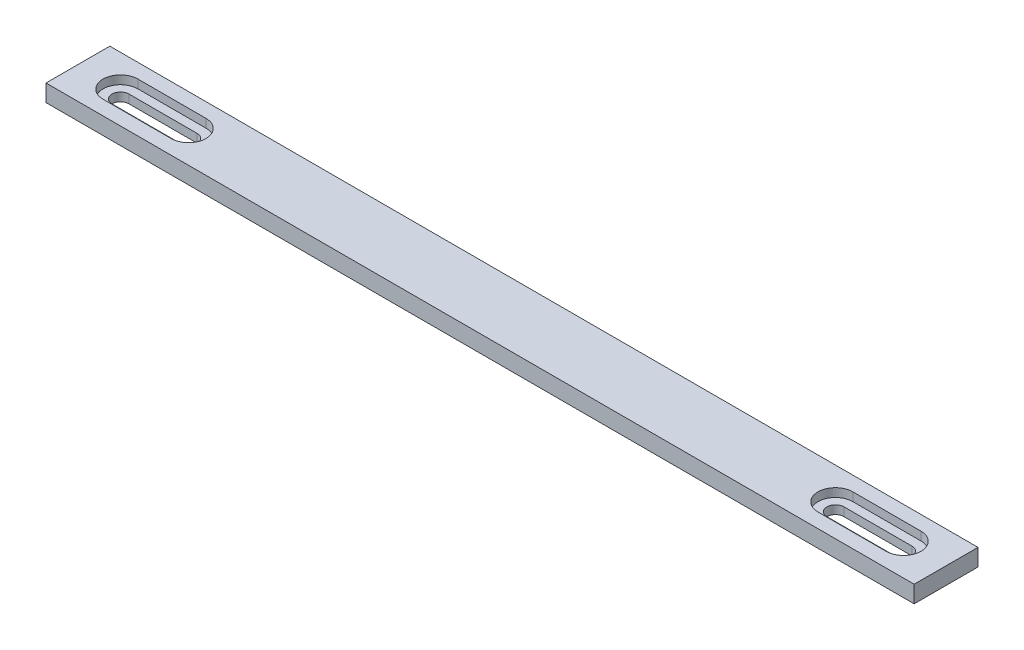
ISO-10303-21;
HEADER;
FILE_DESCRIPTION(('STEP AP214'),'2;1');
FILE_NAME('part.step','',(''),(''),'','','');
FILE_SCHEMA(('AUTOMOTIVE_DESIGN { 1 0 10303 214 1 1 1 1 }'));
ENDSEC;
DATA;
#1=APPLICATION_CONTEXT('core data for automotive mechanical design processes');
#2=APPLICATION_PROTOCOL_DEFINITION('international standard','automotive_design',2000,#1);
#3=PRODUCT_CONTEXT('',#1,'mechanical');
#4=PRODUCT('Part','Part','',(#3));
#5=PRODUCT_RELATED_PRODUCT_CATEGORY('part','',(#4));
#6=PRODUCT_DEFINITION_FORMATION('','',#4);
#7=PRODUCT_DEFINITION_CONTEXT('part definition',#1,'design');
#8=PRODUCT_DEFINITION('design','',#6,#7);
#9=PRODUCT_DEFINITION_SHAPE('','',#8);
#10=(LENGTH_UNIT() NAMED_UNIT(*) SI_UNIT(.MILLI.,.METRE.));
#11=(NAMED_UNIT(*) PLANE_ANGLE_UNIT() SI_UNIT($,.RADIAN.));
#12=(NAMED_UNIT(*) SI_UNIT($,.STERADIAN.) SOLID_ANGLE_UNIT());
#13=UNCERTAINTY_MEASURE_WITH_UNIT(LENGTH_MEASURE(1.E-05),#10,'distance_accuracy_value','');
#14=(GEOMETRIC_REPRESENTATION_CONTEXT(3) GLOBAL_UNCERTAINTY_ASSIGNED_CONTEXT((#13)) GLOBAL_UNIT_ASSIGNED_CONTEXT((#10,
#11,#12)) REPRESENTATION_CONTEXT('',''));
#15=CARTESIAN_POINT('',(0.,0.,0.));
#16=DIRECTION('',(0.,0.,1.));
#17=DIRECTION('',(1.,0.,0.));
#18=AXIS2_PLACEMENT_3D('',#15,#16,#17);
#19=CARTESIAN_POINT('',(178.,-4.,-7.5));
#20=DIRECTION('',(0.,1.,0.));
#21=DIRECTION('',(0.,0.,1.));
#22=AXIS2_PLACEMENT_3D('',#19,#20,#21);
#23=CYLINDRICAL_SURFACE('',#22,2.);
#24=CARTESIAN_POINT('',(178.,-2.,-7.5));
#25=DIRECTION('',(0.,1.,0.));
#26=DIRECTION('',(0.,0.,1.));
#27=AXIS2_PLACEMENT_3D('',#24,#25,#26);
#28=CIRCLE('',#27,2.);
#29=CARTESIAN_POINT('',(178.,-2.,-5.5));
#30=VERTEX_POINT('',#29);
#31=CARTESIAN_POINT('',(178.,-2.,-9.5));
#32=VERTEX_POINT('',#31);
#33=EDGE_CURVE('E284',#30,#32,#28,.F.);
#34=ORIENTED_EDGE('',*,*,#33,.F.);
#35=DIRECTION('',(0.,1.,0.));
#36=VECTOR('',#35,1.);
#37=CARTESIAN_POINT('',(178.,-4.,-5.5));
#38=LINE('',#37,#36);
#39=CARTESIAN_POINT('',(178.,-4.,-5.5));
#40=VERTEX_POINT('',#39);
#41=EDGE_CURVE('E337',#40,#30,#38,.T.);
#42=ORIENTED_EDGE('',*,*,#41,.F.);
#43=CARTESIAN_POINT('',(178.,-4.,-7.5));
#44=DIRECTION('',(0.,1.,0.));
#45=DIRECTION('',(0.,0.,1.));
#46=AXIS2_PLACEMENT_3D('',#43,#44,#45);
#47=CIRCLE('',#46,2.);
#48=CARTESIAN_POINT('',(178.,-4.,-9.5));
#49=VERTEX_POINT('',#48);
#50=EDGE_CURVE('E287',#49,#40,#47,.T.);
#51=ORIENTED_EDGE('',*,*,#50,.F.);
#52=DIRECTION('',(0.,1.,0.));
#53=VECTOR('',#52,1.);
#54=CARTESIAN_POINT('',(178.,-4.,-9.5));
#55=LINE('',#54,#53);
#56=EDGE_CURVE('E293',#49,#32,#55,.T.);
#57=ORIENTED_EDGE('',*,*,#56,.T.);
#58=EDGE_LOOP('',(#34,#42,#51,#57));
#59=FACE_BOUND('',#58,.T.);
#60=ADVANCED_FACE('F39',(#59),#23,.F.);
#61=CARTESIAN_POINT('',(178.,-4.,-9.5));
#62=DIRECTION('',(0.,0.,-1.));
#63=DIRECTION('',(0.,1.,0.));
#64=AXIS2_PLACEMENT_3D('',#61,#62,#63);
#65=PLANE('',#64);
#66=DIRECTION('',(1.,0.,0.));
#67=VECTOR('',#66,1.);
#68=CARTESIAN_POINT('',(178.,-2.,-9.5));
#69=LINE('',#68,#67);
#70=CARTESIAN_POINT('',(194.,-2.,-9.5));
#71=VERTEX_POINT('',#70);
#72=EDGE_CURVE('E281',#32,#71,#69,.T.);
#73=ORIENTED_EDGE('',*,*,#72,.F.);
#74=ORIENTED_EDGE('',*,*,#56,.F.);
#75=DIRECTION('',(-1.,0.,0.));
#76=VECTOR('',#75,1.);
#77=CARTESIAN_POINT('',(178.,-4.,-9.5));
#78=LINE('',#77,#76);
#79=CARTESIAN_POINT('',(194.,-4.,-9.5));
#80=VERTEX_POINT('',#79);
#81=EDGE_CURVE('E333',#80,#49,#78,.T.);
#82=ORIENTED_EDGE('',*,*,#81,.F.);
#83=DIRECTION('',(0.,1.,0.));
#84=VECTOR('',#83,1.);
#85=CARTESIAN_POINT('',(194.,-4.,-9.5));
#86=LINE('',#85,#84);
#87=EDGE_CURVE('E341',#80,#71,#86,.T.);
#88=ORIENTED_EDGE('',*,*,#87,.T.);
#89=EDGE_LOOP('',(#73,#74,#82,#88));
#90=FACE_BOUND('',#89,.T.);
#91=ADVANCED_FACE('F421',(#90),#65,.F.);
#92=CARTESIAN_POINT('',(194.,-4.,-7.5));
#93=DIRECTION('',(0.,1.,0.));
#94=DIRECTION('',(0.,0.,1.));
#95=AXIS2_PLACEMENT_3D('',#92,#93,#94);
#96=CYLINDRICAL_SURFACE('',#95,2.);
#97=CARTESIAN_POINT('',(194.,-2.,-7.5));
#98=DIRECTION('',(0.,1.,0.));
#99=DIRECTION('',(0.,0.,1.));
#100=AXIS2_PLACEMENT_3D('',#97,#98,#99);
#101=CIRCLE('',#100,2.);
#102=CARTESIAN_POINT('',(194.,-2.,-5.5));
#103=VERTEX_POINT('',#102);
#104=EDGE_CURVE('E278',#71,#103,#101,.F.);
#105=ORIENTED_EDGE('',*,*,#104,.F.);
#106=ORIENTED_EDGE('',*,*,#87,.F.);
#107=CARTESIAN_POINT('',(194.,-4.,-7.5));
#108=DIRECTION('',(0.,1.,0.));
#109=DIRECTION('',(0.,0.,1.));
#110=AXIS2_PLACEMENT_3D('',#107,#108,#109);
#111=CIRCLE('',#110,2.);
#112=CARTESIAN_POINT('',(194.,-4.,-5.5));
#113=VERTEX_POINT('',#112);
#114=EDGE_CURVE('E329',#113,#80,#111,.T.);
#115=ORIENTED_EDGE('',*,*,#114,.F.);
#116=DIRECTION('',(0.,1.,0.));
#117=VECTOR('',#116,1.);
#118=CARTESIAN_POINT('',(194.,-4.,-5.5));
#119=LINE('',#118,#117);
#120=EDGE_CURVE('E345',#113,#103,#119,.T.);
#121=ORIENTED_EDGE('',*,*,#120,.T.);
#122=EDGE_LOOP('',(#105,#106,#115,#121));
#123=FACE_BOUND('',#122,.T.);
#124=ADVANCED_FACE('F427',(#123),#96,.F.);
#125=CARTESIAN_POINT('',(178.,-4.,-5.5));
#126=DIRECTION('',(0.,0.,1.));
#127=DIRECTION('',(0.,-1.,0.));
#128=AXIS2_PLACEMENT_3D('',#125,#126,#127);
#129=PLANE('',#128);
#130=DIRECTION('',(-1.,0.,0.));
#131=VECTOR('',#130,1.);
#132=CARTESIAN_POINT('',(178.,-2.,-5.5));
#133=LINE('',#132,#131);
#134=EDGE_CURVE('E11',#103,#30,#133,.T.);
#135=ORIENTED_EDGE('',*,*,#134,.F.);
#136=ORIENTED_EDGE('',*,*,#120,.F.);
#137=DIRECTION('',(1.,0.,0.));
#138=VECTOR('',#137,1.);
#139=CARTESIAN_POINT('',(178.,-4.,-5.5));
#140=LINE('',#139,#138);
#141=EDGE_CURVE('E325',#40,#113,#140,.T.);
#142=ORIENTED_EDGE('',*,*,#141,.F.);
#143=ORIENTED_EDGE('',*,*,#41,.T.);
#144=EDGE_LOOP('',(#135,#136,#142,#143));
#145=FACE_BOUND('',#144,.T.);
#146=ADVANCED_FACE('F433',(#145),#129,.F.);
#147=CARTESIAN_POINT('',(10.,-4.,-7.5));
#148=DIRECTION('',(0.,1.,0.));
#149=DIRECTION('',(0.,0.,1.));
#150=AXIS2_PLACEMENT_3D('',#147,#148,#149);
#151=CYLINDRICAL_SURFACE('',#150,2.);
#152=CARTESIAN_POINT('',(10.,-2.,-7.5));
#153=DIRECTION('',(0.,1.,0.));
#154=DIRECTION('',(0.,0.,1.));
#155=AXIS2_PLACEMENT_3D('',#152,#153,#154);
#156=CIRCLE('',#155,2.);
#157=CARTESIAN_POINT('',(10.,-2.,-5.5));
#158=VERTEX_POINT('',#157);
#159=CARTESIAN_POINT('',(10.,-2.,-9.5));
#160=VERTEX_POINT('',#159);
#161=EDGE_CURVE('E275',#158,#160,#156,.F.);
#162=ORIENTED_EDGE('',*,*,#161,.F.);
#163=DIRECTION('',(0.,1.,0.));
#164=VECTOR('',#163,1.);
#165=CARTESIAN_POINT('',(10.,-4.,-5.5));
#166=LINE('',#165,#164);
#167=CARTESIAN_POINT('',(10.,-4.,-5.5));
#168=VERTEX_POINT('',#167);
#169=EDGE_CURVE('E305',#168,#158,#166,.T.);
#170=ORIENTED_EDGE('',*,*,#169,.F.);
#171=CARTESIAN_POINT('',(10.,-4.,-7.5));
#172=DIRECTION('',(0.,1.,0.));
#173=DIRECTION('',(0.,0.,1.));
#174=AXIS2_PLACEMENT_3D('',#171,#172,#173);
#175=CIRCLE('',#174,2.);
#176=CARTESIAN_POINT('',(10.,-4.,-9.5));
#177=VERTEX_POINT('',#176);
#178=EDGE_CURVE('E288',#177,#168,#175,.T.);
#179=ORIENTED_EDGE('',*,*,#178,.F.);
#180=DIRECTION('',(0.,1.,0.));
#181=VECTOR('',#180,1.);
#182=CARTESIAN_POINT('',(10.,-4.,-9.5));
#183=LINE('',#182,#181);
#184=EDGE_CURVE('E306',#177,#160,#183,.T.);
#185=ORIENTED_EDGE('',*,*,#184,.T.);
#186=EDGE_LOOP('',(#162,#170,#179,#185));
#187=FACE_BOUND('',#186,.T.);
#188=ADVANCED_FACE('F400',(#187),#151,.F.);
#189=CARTESIAN_POINT('',(10.,-4.,-9.5));
#190=DIRECTION('',(0.,0.,-1.));
#191=DIRECTION('',(-1.,0.,0.));
#192=AXIS2_PLACEMENT_3D('',#189,#190,#191);
#193=PLANE('',#192);
#194=DIRECTION('',(1.,0.,0.));
#195=VECTOR('',#194,1.);
#196=CARTESIAN_POINT('',(10.,-2.,-9.5));
#197=LINE('',#196,#195);
#198=CARTESIAN_POINT('',(26.,-2.,-9.5));
#199=VERTEX_POINT('',#198);
#200=EDGE_CURVE('E272',#160,#199,#197,.T.);
#201=ORIENTED_EDGE('',*,*,#200,.F.);
#202=ORIENTED_EDGE('',*,*,#184,.F.);
#203=DIRECTION('',(-1.,0.,0.));
#204=VECTOR('',#203,1.);
#205=CARTESIAN_POINT('',(10.,-4.,-9.5));
#206=LINE('',#205,#204);
#207=CARTESIAN_POINT('',(26.,-4.,-9.5));
#208=VERTEX_POINT('',#207);
#209=EDGE_CURVE('E301',#208,#177,#206,.T.);
#210=ORIENTED_EDGE('',*,*,#209,.F.);
#211=DIRECTION('',(0.,1.,0.));
#212=VECTOR('',#211,1.);
#213=CARTESIAN_POINT('',(26.,-4.,-9.5));
#214=LINE('',#213,#212);
#215=EDGE_CURVE('E311',#208,#199,#214,.T.);
#216=ORIENTED_EDGE('',*,*,#215,.T.);
#217=EDGE_LOOP('',(#201,#202,#210,#216));
#218=FACE_BOUND('',#217,.T.);
#219=ADVANCED_FACE('F409',(#218),#193,.F.);
#220=CARTESIAN_POINT('',(26.,-4.,-7.5));
#221=DIRECTION('',(0.,1.,0.));
#222=DIRECTION('',(0.,0.,1.));
#223=AXIS2_PLACEMENT_3D('',#220,#221,#222);
#224=CYLINDRICAL_SURFACE('',#223,2.);
#225=CARTESIAN_POINT('',(26.,-2.,-7.5));
#226=DIRECTION('',(0.,1.,0.));
#227=DIRECTION('',(0.,0.,1.));
#228=AXIS2_PLACEMENT_3D('',#225,#226,#227);
#229=CIRCLE('',#228,2.);
#230=CARTESIAN_POINT('',(26.,-2.,-5.5));
#231=VERTEX_POINT('',#230);
#232=EDGE_CURVE('E223',#199,#231,#229,.F.);
#233=ORIENTED_EDGE('',*,*,#232,.F.);
#234=ORIENTED_EDGE('',*,*,#215,.F.);
#235=CARTESIAN_POINT('',(26.,-4.,-7.5));
#236=DIRECTION('',(0.,1.,0.));
#237=DIRECTION('',(0.,0.,1.));
#238=AXIS2_PLACEMENT_3D('',#235,#236,#237);
#239=CIRCLE('',#238,2.);
#240=CARTESIAN_POINT('',(26.,-4.,-5.5));
#241=VERTEX_POINT('',#240);
#242=EDGE_CURVE('E297',#241,#208,#239,.T.);
#243=ORIENTED_EDGE('',*,*,#242,.F.);
#244=DIRECTION('',(0.,1.,0.));
#245=VECTOR('',#244,1.);
#246=CARTESIAN_POINT('',(26.,-4.,-5.5));
#247=LINE('',#246,#245);
#248=EDGE_CURVE('E315',#241,#231,#247,.T.);
#249=ORIENTED_EDGE('',*,*,#248,.T.);
#250=EDGE_LOOP('',(#233,#234,#243,#249));
#251=FACE_BOUND('',#250,.T.);
#252=ADVANCED_FACE('F411',(#251),#224,.F.);
#253=CARTESIAN_POINT('',(10.,-4.,-5.5));
#254=DIRECTION('',(0.,0.,1.));
#255=DIRECTION('',(1.,0.,0.));
#256=AXIS2_PLACEMENT_3D('',#253,#254,#255);
#257=PLANE('',#256);
#258=DIRECTION('',(-1.,0.,0.));
#259=VECTOR('',#258,1.);
#260=CARTESIAN_POINT('',(10.,-2.,-5.5));
#261=LINE('',#260,#259);
#262=EDGE_CURVE('E48',#231,#158,#261,.T.);
#263=ORIENTED_EDGE('',*,*,#262,.F.);
#264=ORIENTED_EDGE('',*,*,#248,.F.);
#265=DIRECTION('',(1.,0.,0.));
#266=VECTOR('',#265,1.);
#267=CARTESIAN_POINT('',(10.,-4.,-5.5));
#268=LINE('',#267,#266);
#269=EDGE_CURVE('E292',#168,#241,#268,.T.);
#270=ORIENTED_EDGE('',*,*,#269,.F.);
#271=ORIENTED_EDGE('',*,*,#169,.T.);
#272=EDGE_LOOP('',(#263,#264,#270,#271));
#273=FACE_BOUND('',#272,.T.);
#274=ADVANCED_FACE('F403',(#273),#257,.F.);
#275=CARTESIAN_POINT('',(204.,0.,-15.));
#276=DIRECTION('',(0.,-1.,0.));
#277=DIRECTION('',(0.,0.,-1.));
#278=AXIS2_PLACEMENT_3D('',#275,#276,#277);
#279=PLANE('',#278);
#280=DIRECTION('',(1.,0.,0.));
#281=VECTOR('',#280,1.);
#282=CARTESIAN_POINT('',(10.,0.,-3.4));
#283=LINE('',#282,#281);
#284=CARTESIAN_POINT('',(10.,0.,-3.4));
#285=VERTEX_POINT('',#284);
#286=CARTESIAN_POINT('',(26.,0.,-3.4));
#287=VERTEX_POINT('',#286);
#288=EDGE_CURVE('E213',#285,#287,#283,.T.);
#289=ORIENTED_EDGE('',*,*,#288,.F.);
#290=CARTESIAN_POINT('',(10.,0.,-7.5));
#291=DIRECTION('',(0.,1.,0.));
#292=DIRECTION('',(0.,0.,1.));
#293=AXIS2_PLACEMENT_3D('',#290,#291,#292);
#294=CIRCLE('',#293,4.1);
#295=CARTESIAN_POINT('',(10.,0.,-11.6));
#296=VERTEX_POINT('',#295);
#297=EDGE_CURVE('E55',#296,#285,#294,.T.);
#298=ORIENTED_EDGE('',*,*,#297,.F.);
#299=DIRECTION('',(-1.,0.,0.));
#300=VECTOR('',#299,1.);
#301=CARTESIAN_POINT('',(10.,0.,-11.6));
#302=LINE('',#301,#300);
#303=CARTESIAN_POINT('',(26.,0.,-11.6));
#304=VERTEX_POINT('',#303);
#305=EDGE_CURVE('E200',#304,#296,#302,.T.);
#306=ORIENTED_EDGE('',*,*,#305,.F.);
#307=CARTESIAN_POINT('',(26.,0.,-7.5));
#308=DIRECTION('',(0.,1.,0.));
#309=DIRECTION('',(0.,0.,1.));
#310=AXIS2_PLACEMENT_3D('',#307,#308,#309);
#311=CIRCLE('',#310,4.1);
#312=EDGE_CURVE('E204',#287,#304,#311,.T.);
#313=ORIENTED_EDGE('',*,*,#312,.F.);
#314=EDGE_LOOP('',(#289,#298,#306,#313));
#315=FACE_BOUND('',#314,.T.);
#316=DIRECTION('',(1.,0.,0.));
#317=VECTOR('',#316,1.);
#318=CARTESIAN_POINT('',(178.,0.,-3.4));
#319=LINE('',#318,#317);
#320=CARTESIAN_POINT('',(178.,0.,-3.4));
#321=VERTEX_POINT('',#320);
#322=CARTESIAN_POINT('',(194.,0.,-3.4));
#323=VERTEX_POINT('',#322);
#324=EDGE_CURVE('E249',#321,#323,#319,.T.);
#325=ORIENTED_EDGE('',*,*,#324,.F.);
#326=CARTESIAN_POINT('',(178.,0.,-7.5));
#327=DIRECTION('',(0.,1.,0.));
#328=DIRECTION('',(0.,0.,1.));
#329=AXIS2_PLACEMENT_3D('',#326,#327,#328);
#330=CIRCLE('',#329,4.1);
#331=CARTESIAN_POINT('',(178.,0.,-11.6));
#332=VERTEX_POINT('',#331);
#333=EDGE_CURVE('E63',#332,#321,#330,.T.);
#334=ORIENTED_EDGE('',*,*,#333,.F.);
#335=DIRECTION('',(-1.,0.,0.));
#336=VECTOR('',#335,1.);
#337=CARTESIAN_POINT('',(178.,0.,-11.6));
#338=LINE('',#337,#336);
#339=CARTESIAN_POINT('',(194.,0.,-11.6));
#340=VERTEX_POINT('',#339);
#341=EDGE_CURVE('E234',#340,#332,#338,.T.);
#342=ORIENTED_EDGE('',*,*,#341,.F.);
#343=CARTESIAN_POINT('',(194.,0.,-7.5));
#344=DIRECTION('',(0.,1.,0.));
#345=DIRECTION('',(0.,0.,1.));
#346=AXIS2_PLACEMENT_3D('',#343,#344,#345);
#347=CIRCLE('',#346,4.1);
#348=EDGE_CURVE('E253',#323,#340,#347,.T.);
#349=ORIENTED_EDGE('',*,*,#348,.F.);
#350=EDGE_LOOP('',(#325,#334,#342,#349));
#351=FACE_BOUND('',#350,.T.);
#352=DIRECTION('',(0.,0.,1.));
#353=VECTOR('',#352,1.);
#354=CARTESIAN_POINT('',(0.,0.,-15.));
#355=LINE('',#354,#353);
#356=CARTESIAN_POINT('',(0.,0.,-15.));
#357=VERTEX_POINT('',#356);
#358=CARTESIAN_POINT('',(0.,0.,0.));
#359=VERTEX_POINT('',#358);
#360=EDGE_CURVE('E310',#357,#359,#355,.T.);
#361=ORIENTED_EDGE('',*,*,#360,.T.);
#362=DIRECTION('',(-1.,0.,0.));
#363=VECTOR('',#362,1.);
#364=CARTESIAN_POINT('',(204.,0.,0.));
#365=LINE('',#364,#363);
#366=CARTESIAN_POINT('',(204.,0.,0.));
#367=VERTEX_POINT('',#366);
#368=EDGE_CURVE('E389',#367,#359,#365,.T.);
#369=ORIENTED_EDGE('',*,*,#368,.F.);
#370=DIRECTION('',(0.,0.,1.));
#371=VECTOR('',#370,1.);
#372=CARTESIAN_POINT('',(204.,0.,-15.));
#373=LINE('',#372,#371);
#374=CARTESIAN_POINT('',(204.,0.,-15.));
#375=VERTEX_POINT('',#374);
#376=EDGE_CURVE('E352',#375,#367,#373,.T.);
#377=ORIENTED_EDGE('',*,*,#376,.F.);
#378=DIRECTION('',(-1.,0.,0.));
#379=VECTOR('',#378,1.);
#380=CARTESIAN_POINT('',(204.,0.,-15.));
#381=LINE('',#380,#379);
#382=EDGE_CURVE('E366',#375,#357,#381,.T.);
#383=ORIENTED_EDGE('',*,*,#382,.T.);
#384=EDGE_LOOP('',(#361,#369,#377,#383));
#385=FACE_BOUND('',#384,.T.);
#386=ADVANCED_FACE('F41',(#315,#351,#385),#279,.F.);
#387=CARTESIAN_POINT('',(204.,0.,0.));
#388=DIRECTION('',(0.,0.,-1.));
#389=DIRECTION('',(0.,1.,0.));
#390=AXIS2_PLACEMENT_3D('',#387,#388,#389);
#391=PLANE('',#390);
#392=DIRECTION('',(0.,-1.,0.));
#393=VECTOR('',#392,1.);
#394=CARTESIAN_POINT('',(0.,0.,0.));
#395=LINE('',#394,#393);
#396=CARTESIAN_POINT('',(0.,-4.,0.));
#397=VERTEX_POINT('',#396);
#398=EDGE_CURVE('E370',#359,#397,#395,.T.);
#399=ORIENTED_EDGE('',*,*,#398,.T.);
#400=DIRECTION('',(-1.,0.,0.));
#401=VECTOR('',#400,1.);
#402=CARTESIAN_POINT('',(204.,-4.,0.));
#403=LINE('',#402,#401);
#404=CARTESIAN_POINT('',(204.,-4.,0.));
#405=VERTEX_POINT('',#404);
#406=EDGE_CURVE('E385',#405,#397,#403,.T.);
#407=ORIENTED_EDGE('',*,*,#406,.F.);
#408=DIRECTION('',(0.,-1.,0.));
#409=VECTOR('',#408,1.);
#410=CARTESIAN_POINT('',(204.,0.,0.));
#411=LINE('',#410,#409);
#412=EDGE_CURVE('E356',#367,#405,#411,.T.);
#413=ORIENTED_EDGE('',*,*,#412,.F.);
#414=ORIENTED_EDGE('',*,*,#368,.T.);
#415=EDGE_LOOP('',(#399,#407,#413,#414));
#416=FACE_BOUND('',#415,.T.);
#417=ADVANCED_FACE('F448',(#416),#391,.F.);
#418=CARTESIAN_POINT('',(204.,-4.,0.));
#419=DIRECTION('',(0.,1.,0.));
#420=DIRECTION('',(0.,0.,1.));
#421=AXIS2_PLACEMENT_3D('',#418,#419,#420);
#422=PLANE('',#421);
#423=ORIENTED_EDGE('',*,*,#209,.T.);
#424=ORIENTED_EDGE('',*,*,#178,.T.);
#425=ORIENTED_EDGE('',*,*,#269,.T.);
#426=ORIENTED_EDGE('',*,*,#242,.T.);
#427=EDGE_LOOP('',(#423,#424,#425,#426));
#428=FACE_BOUND('',#427,.T.);
#429=ORIENTED_EDGE('',*,*,#81,.T.);
#430=ORIENTED_EDGE('',*,*,#50,.T.);
#431=ORIENTED_EDGE('',*,*,#141,.T.);
#432=ORIENTED_EDGE('',*,*,#114,.T.);
#433=EDGE_LOOP('',(#429,#430,#431,#432));
#434=FACE_BOUND('',#433,.T.);
#435=DIRECTION('',(0.,0.,-1.));
#436=VECTOR('',#435,1.);
#437=CARTESIAN_POINT('',(0.,-4.,0.));
#438=LINE('',#437,#436);
#439=CARTESIAN_POINT('',(0.,-4.,-15.));
#440=VERTEX_POINT('',#439);
#441=EDGE_CURVE('E373',#397,#440,#438,.T.);
#442=ORIENTED_EDGE('',*,*,#441,.T.);
#443=DIRECTION('',(-1.,0.,0.));
#444=VECTOR('',#443,1.);
#445=CARTESIAN_POINT('',(204.,-4.,-15.));
#446=LINE('',#445,#444);
#447=CARTESIAN_POINT('',(204.,-4.,-15.));
#448=VERTEX_POINT('',#447);
#449=EDGE_CURVE('E381',#448,#440,#446,.T.);
#450=ORIENTED_EDGE('',*,*,#449,.F.);
#451=DIRECTION('',(0.,0.,-1.));
#452=VECTOR('',#451,1.);
#453=CARTESIAN_POINT('',(204.,-4.,0.));
#454=LINE('',#453,#452);
#455=EDGE_CURVE('E360',#405,#448,#454,.T.);
#456=ORIENTED_EDGE('',*,*,#455,.F.);
#457=ORIENTED_EDGE('',*,*,#406,.T.);
#458=EDGE_LOOP('',(#442,#450,#456,#457));
#459=FACE_BOUND('',#458,.T.);
#460=ADVANCED_FACE('F405',(#428,#434,#459),#422,.F.);
#461=CARTESIAN_POINT('',(204.,-4.,-15.));
#462=DIRECTION('',(0.,0.,1.));
#463=DIRECTION('',(1.,0.,0.));
#464=AXIS2_PLACEMENT_3D('',#461,#462,#463);
#465=PLANE('',#464);
#466=DIRECTION('',(0.,1.,0.));
#467=VECTOR('',#466,1.);
#468=CARTESIAN_POINT('',(0.,-4.,-15.));
#469=LINE('',#468,#467);
#470=EDGE_CURVE('E357',#440,#357,#469,.T.);
#471=ORIENTED_EDGE('',*,*,#470,.T.);
#472=ORIENTED_EDGE('',*,*,#382,.F.);
#473=DIRECTION('',(0.,1.,0.));
#474=VECTOR('',#473,1.);
#475=CARTESIAN_POINT('',(204.,-4.,-15.));
#476=LINE('',#475,#474);
#477=EDGE_CURVE('E363',#448,#375,#476,.T.);
#478=ORIENTED_EDGE('',*,*,#477,.F.);
#479=ORIENTED_EDGE('',*,*,#449,.T.);
#480=EDGE_LOOP('',(#471,#472,#478,#479));
#481=FACE_BOUND('',#480,.T.);
#482=ADVANCED_FACE('F439',(#481),#465,.F.);
#483=CARTESIAN_POINT('',(204.,0.,0.));
#484=DIRECTION('',(1.,0.,0.));
#485=DIRECTION('',(0.,0.,-1.));
#486=AXIS2_PLACEMENT_3D('',#483,#484,#485);
#487=PLANE('',#486);
#488=ORIENTED_EDGE('',*,*,#376,.T.);
#489=ORIENTED_EDGE('',*,*,#412,.T.);
#490=ORIENTED_EDGE('',*,*,#455,.T.);
#491=ORIENTED_EDGE('',*,*,#477,.T.);
#492=EDGE_LOOP('',(#488,#489,#490,#491));
#493=FACE_BOUND('',#492,.T.);
#494=ADVANCED_FACE('F435',(#493),#487,.T.);
#495=CARTESIAN_POINT('',(0.,0.,0.));
#496=DIRECTION('',(1.,0.,0.));
#497=DIRECTION('',(0.,0.,-1.));
#498=AXIS2_PLACEMENT_3D('',#495,#496,#497);
#499=PLANE('',#498);
#500=ORIENTED_EDGE('',*,*,#360,.F.);
#501=ORIENTED_EDGE('',*,*,#470,.F.);
#502=ORIENTED_EDGE('',*,*,#441,.F.);
#503=ORIENTED_EDGE('',*,*,#398,.F.);
#504=EDGE_LOOP('',(#500,#501,#502,#503));
#505=FACE_BOUND('',#504,.T.);
#506=ADVANCED_FACE('F438',(#505),#499,.F.);
#507=CARTESIAN_POINT('',(10.,-2.,-7.5));
#508=DIRECTION('',(0.,1.,0.));
#509=DIRECTION('',(0.,0.,1.));
#510=AXIS2_PLACEMENT_3D('',#507,#508,#509);
#511=PLANE('',#510);
#512=CARTESIAN_POINT('',(10.,-2.,-7.5));
#513=DIRECTION('',(0.,1.,0.));
#514=DIRECTION('',(0.,0.,1.));
#515=AXIS2_PLACEMENT_3D('',#512,#513,#514);
#516=CIRCLE('',#515,4.1);
#517=CARTESIAN_POINT('',(10.,-2.,-11.6));
#518=VERTEX_POINT('',#517);
#519=CARTESIAN_POINT('',(10.,-2.,-3.4));
#520=VERTEX_POINT('',#519);
#521=EDGE_CURVE('E178',#518,#520,#516,.T.);
#522=ORIENTED_EDGE('',*,*,#521,.T.);
#523=DIRECTION('',(1.,0.,0.));
#524=VECTOR('',#523,1.);
#525=CARTESIAN_POINT('',(10.,-2.,-3.4));
#526=LINE('',#525,#524);
#527=CARTESIAN_POINT('',(26.,-2.,-3.4));
#528=VERTEX_POINT('',#527);
#529=EDGE_CURVE('E188',#520,#528,#526,.T.);
#530=ORIENTED_EDGE('',*,*,#529,.T.);
#531=CARTESIAN_POINT('',(26.,-2.,-7.5));
#532=DIRECTION('',(0.,1.,0.));
#533=DIRECTION('',(0.,0.,1.));
#534=AXIS2_PLACEMENT_3D('',#531,#532,#533);
#535=CIRCLE('',#534,4.1);
#536=CARTESIAN_POINT('',(26.,-2.,-11.6));
#537=VERTEX_POINT('',#536);
#538=EDGE_CURVE('E194',#528,#537,#535,.T.);
#539=ORIENTED_EDGE('',*,*,#538,.T.);
#540=DIRECTION('',(-1.,0.,0.));
#541=VECTOR('',#540,1.);
#542=CARTESIAN_POINT('',(10.,-2.,-11.6));
#543=LINE('',#542,#541);
#544=EDGE_CURVE('E185',#537,#518,#543,.T.);
#545=ORIENTED_EDGE('',*,*,#544,.T.);
#546=EDGE_LOOP('',(#522,#530,#539,#545));
#547=FACE_BOUND('',#546,.T.);
#548=ORIENTED_EDGE('',*,*,#161,.T.);
#549=ORIENTED_EDGE('',*,*,#200,.T.);
#550=ORIENTED_EDGE('',*,*,#232,.T.);
#551=ORIENTED_EDGE('',*,*,#262,.T.);
#552=EDGE_LOOP('',(#548,#549,#550,#551));
#553=FACE_BOUND('',#552,.T.);
#554=ADVANCED_FACE('F196',(#547,#553),#511,.T.);
#555=CARTESIAN_POINT('',(10.,-2.,-7.5));
#556=DIRECTION('',(0.,1.,0.));
#557=DIRECTION('',(0.,0.,1.));
#558=AXIS2_PLACEMENT_3D('',#555,#556,#557);
#559=CYLINDRICAL_SURFACE('',#558,4.1);
#560=ORIENTED_EDGE('',*,*,#297,.T.);
#561=DIRECTION('',(0.,1.,0.));
#562=VECTOR('',#561,1.);
#563=CARTESIAN_POINT('',(10.,-2.,-3.4));
#564=LINE('',#563,#562);
#565=EDGE_CURVE('E174',#520,#285,#564,.T.);
#566=ORIENTED_EDGE('',*,*,#565,.F.);
#567=ORIENTED_EDGE('',*,*,#521,.F.);
#568=DIRECTION('',(0.,1.,0.));
#569=VECTOR('',#568,1.);
#570=CARTESIAN_POINT('',(10.,-2.,-11.6));
#571=LINE('',#570,#569);
#572=EDGE_CURVE('E220',#518,#296,#571,.T.);
#573=ORIENTED_EDGE('',*,*,#572,.T.);
#574=EDGE_LOOP('',(#560,#566,#567,#573));
#575=FACE_BOUND('',#574,.T.);
#576=ADVANCED_FACE('F176',(#575),#559,.F.);
#577=CARTESIAN_POINT('',(10.,-2.,-11.6));
#578=DIRECTION('',(0.,0.,-1.));
#579=DIRECTION('',(0.,1.,0.));
#580=AXIS2_PLACEMENT_3D('',#577,#578,#579);
#581=PLANE('',#580);
#582=ORIENTED_EDGE('',*,*,#305,.T.);
#583=ORIENTED_EDGE('',*,*,#572,.F.);
#584=ORIENTED_EDGE('',*,*,#544,.F.);
#585=DIRECTION('',(0.,1.,0.));
#586=VECTOR('',#585,1.);
#587=CARTESIAN_POINT('',(26.,-2.,-11.6));
#588=LINE('',#587,#586);
#589=EDGE_CURVE('E224',#537,#304,#588,.T.);
#590=ORIENTED_EDGE('',*,*,#589,.T.);
#591=EDGE_LOOP('',(#582,#583,#584,#590));
#592=FACE_BOUND('',#591,.T.);
#593=ADVANCED_FACE('F509',(#592),#581,.F.);
#594=CARTESIAN_POINT('',(26.,-2.,-7.5));
#595=DIRECTION('',(0.,1.,0.));
#596=DIRECTION('',(0.,0.,1.));
#597=AXIS2_PLACEMENT_3D('',#594,#595,#596);
#598=CYLINDRICAL_SURFACE('',#597,4.1);
#599=ORIENTED_EDGE('',*,*,#312,.T.);
#600=ORIENTED_EDGE('',*,*,#589,.F.);
#601=ORIENTED_EDGE('',*,*,#538,.F.);
#602=DIRECTION('',(0.,1.,0.));
#603=VECTOR('',#602,1.);
#604=CARTESIAN_POINT('',(26.,-2.,-3.4));
#605=LINE('',#604,#603);
#606=EDGE_CURVE('E184',#528,#287,#605,.T.);
#607=ORIENTED_EDGE('',*,*,#606,.T.);
#608=EDGE_LOOP('',(#599,#600,#601,#607));
#609=FACE_BOUND('',#608,.T.);
#610=ADVANCED_FACE('F505',(#609),#598,.F.);
#611=CARTESIAN_POINT('',(10.,-2.,-3.4));
#612=DIRECTION('',(0.,0.,1.));
#613=DIRECTION('',(0.,-1.,0.));
#614=AXIS2_PLACEMENT_3D('',#611,#612,#613);
#615=PLANE('',#614);
#616=ORIENTED_EDGE('',*,*,#288,.T.);
#617=ORIENTED_EDGE('',*,*,#606,.F.);
#618=ORIENTED_EDGE('',*,*,#529,.F.);
#619=ORIENTED_EDGE('',*,*,#565,.T.);
#620=EDGE_LOOP('',(#616,#617,#618,#619));
#621=FACE_BOUND('',#620,.T.);
#622=ADVANCED_FACE('F189',(#621),#615,.F.);
#623=CARTESIAN_POINT('',(178.,-2.,-7.5));
#624=DIRECTION('',(0.,1.,0.));
#625=DIRECTION('',(0.,0.,1.));
#626=AXIS2_PLACEMENT_3D('',#623,#624,#625);
#627=PLANE('',#626);
#628=CARTESIAN_POINT('',(178.,-2.,-7.5));
#629=DIRECTION('',(0.,1.,0.));
#630=DIRECTION('',(0.,0.,1.));
#631=AXIS2_PLACEMENT_3D('',#628,#629,#630);
#632=CIRCLE('',#631,4.1);
#633=CARTESIAN_POINT('',(178.,-2.,-11.6));
#634=VERTEX_POINT('',#633);
#635=CARTESIAN_POINT('',(178.,-2.,-3.4));
#636=VERTEX_POINT('',#635);
#637=EDGE_CURVE('E229',#634,#636,#632,.T.);
#638=ORIENTED_EDGE('',*,*,#637,.T.);
#639=DIRECTION('',(1.,0.,0.));
#640=VECTOR('',#639,1.);
#641=CARTESIAN_POINT('',(178.,-2.,-3.4));
#642=LINE('',#641,#640);
#643=CARTESIAN_POINT('',(194.,-2.,-3.4));
#644=VERTEX_POINT('',#643);
#645=EDGE_CURVE('E233',#636,#644,#642,.T.);
#646=ORIENTED_EDGE('',*,*,#645,.T.);
#647=CARTESIAN_POINT('',(194.,-2.,-7.5));
#648=DIRECTION('',(0.,1.,0.));
#649=DIRECTION('',(0.,0.,1.));
#650=AXIS2_PLACEMENT_3D('',#647,#648,#649);
#651=CIRCLE('',#650,4.1);
#652=CARTESIAN_POINT('',(194.,-2.,-11.6));
#653=VERTEX_POINT('',#652);
#654=EDGE_CURVE('E238',#644,#653,#651,.T.);
#655=ORIENTED_EDGE('',*,*,#654,.T.);
#656=DIRECTION('',(-1.,0.,0.));
#657=VECTOR('',#656,1.);
#658=CARTESIAN_POINT('',(178.,-2.,-11.6));
#659=LINE('',#658,#657);
#660=EDGE_CURVE('E242',#653,#634,#659,.T.);
#661=ORIENTED_EDGE('',*,*,#660,.T.);
#662=EDGE_LOOP('',(#638,#646,#655,#661));
#663=FACE_BOUND('',#662,.T.);
#664=ORIENTED_EDGE('',*,*,#33,.T.);
#665=ORIENTED_EDGE('',*,*,#72,.T.);
#666=ORIENTED_EDGE('',*,*,#104,.T.);
#667=ORIENTED_EDGE('',*,*,#134,.T.);
#668=EDGE_LOOP('',(#664,#665,#666,#667));
#669=FACE_BOUND('',#668,.T.);
#670=ADVANCED_FACE('F482',(#663,#669),#627,.T.);
#671=CARTESIAN_POINT('',(178.,-2.,-7.5));
#672=DIRECTION('',(0.,1.,0.));
#673=DIRECTION('',(0.,0.,1.));
#674=AXIS2_PLACEMENT_3D('',#671,#672,#673);
#675=CYLINDRICAL_SURFACE('',#674,4.1);
#676=ORIENTED_EDGE('',*,*,#333,.T.);
#677=DIRECTION('',(0.,1.,0.));
#678=VECTOR('',#677,1.);
#679=CARTESIAN_POINT('',(178.,-2.,-3.4));
#680=LINE('',#679,#678);
#681=EDGE_CURVE('E246',#636,#321,#680,.T.);
#682=ORIENTED_EDGE('',*,*,#681,.F.);
#683=ORIENTED_EDGE('',*,*,#637,.F.);
#684=DIRECTION('',(0.,1.,0.));
#685=VECTOR('',#684,1.);
#686=CARTESIAN_POINT('',(178.,-2.,-11.6));
#687=LINE('',#686,#685);
#688=EDGE_CURVE('E214',#634,#332,#687,.T.);
#689=ORIENTED_EDGE('',*,*,#688,.T.);
#690=EDGE_LOOP('',(#676,#682,#683,#689));
#691=FACE_BOUND('',#690,.T.);
#692=ADVANCED_FACE('F479',(#691),#675,.F.);
#693=CARTESIAN_POINT('',(178.,-2.,-11.6));
#694=DIRECTION('',(0.,0.,-1.));
#695=DIRECTION('',(0.,1.,0.));
#696=AXIS2_PLACEMENT_3D('',#693,#694,#695);
#697=PLANE('',#696);
#698=ORIENTED_EDGE('',*,*,#341,.T.);
#699=ORIENTED_EDGE('',*,*,#688,.F.);
#700=ORIENTED_EDGE('',*,*,#660,.F.);
#701=DIRECTION('',(0.,1.,0.));
#702=VECTOR('',#701,1.);
#703=CARTESIAN_POINT('',(194.,-2.,-11.6));
#704=LINE('',#703,#702);
#705=EDGE_CURVE('E262',#653,#340,#704,.T.);
#706=ORIENTED_EDGE('',*,*,#705,.T.);
#707=EDGE_LOOP('',(#698,#699,#700,#706));
#708=FACE_BOUND('',#707,.T.);
#709=ADVANCED_FACE('F485',(#708),#697,.F.);
#710=CARTESIAN_POINT('',(194.,-2.,-7.5));
#711=DIRECTION('',(0.,1.,0.));
#712=DIRECTION('',(0.,0.,1.));
#713=AXIS2_PLACEMENT_3D('',#710,#711,#712);
#714=CYLINDRICAL_SURFACE('',#713,4.1);
#715=ORIENTED_EDGE('',*,*,#348,.T.);
#716=ORIENTED_EDGE('',*,*,#705,.F.);
#717=ORIENTED_EDGE('',*,*,#654,.F.);
#718=DIRECTION('',(0.,1.,0.));
#719=VECTOR('',#718,1.);
#720=CARTESIAN_POINT('',(194.,-2.,-3.4));
#721=LINE('',#720,#719);
#722=EDGE_CURVE('E265',#644,#323,#721,.T.);
#723=ORIENTED_EDGE('',*,*,#722,.T.);
#724=EDGE_LOOP('',(#715,#716,#717,#723));
#725=FACE_BOUND('',#724,.T.);
#726=ADVANCED_FACE('F487',(#725),#714,.F.);
#727=CARTESIAN_POINT('',(178.,-2.,-3.4));
#728=DIRECTION('',(0.,0.,1.));
#729=DIRECTION('',(0.,-1.,0.));
#730=AXIS2_PLACEMENT_3D('',#727,#728,#729);
#731=PLANE('',#730);
#732=ORIENTED_EDGE('',*,*,#324,.T.);
#733=ORIENTED_EDGE('',*,*,#722,.F.);
#734=ORIENTED_EDGE('',*,*,#645,.F.);
#735=ORIENTED_EDGE('',*,*,#681,.T.);
#736=EDGE_LOOP('',(#732,#733,#734,#735));
#737=FACE_BOUND('',#736,.T.);
#738=ADVANCED_FACE('F475',(#737),#731,.F.);
#739=CLOSED_SHELL('',(#60,#91,#124,#146,#188,#219,#252,#274,#386,#417,#460,#482,#494,#506,#554,
#576,#593,#610,#622,#670,#692,#709,#726,#738));
#740=MANIFOLD_SOLID_BREP('B2',#739);
#741=ADVANCED_BREP_SHAPE_REPRESENTATION('',(#18,#740),#14);
#742=SHAPE_DEFINITION_REPRESENTATION(#9,#741);
ENDSEC;
END-ISO-10303-21;
